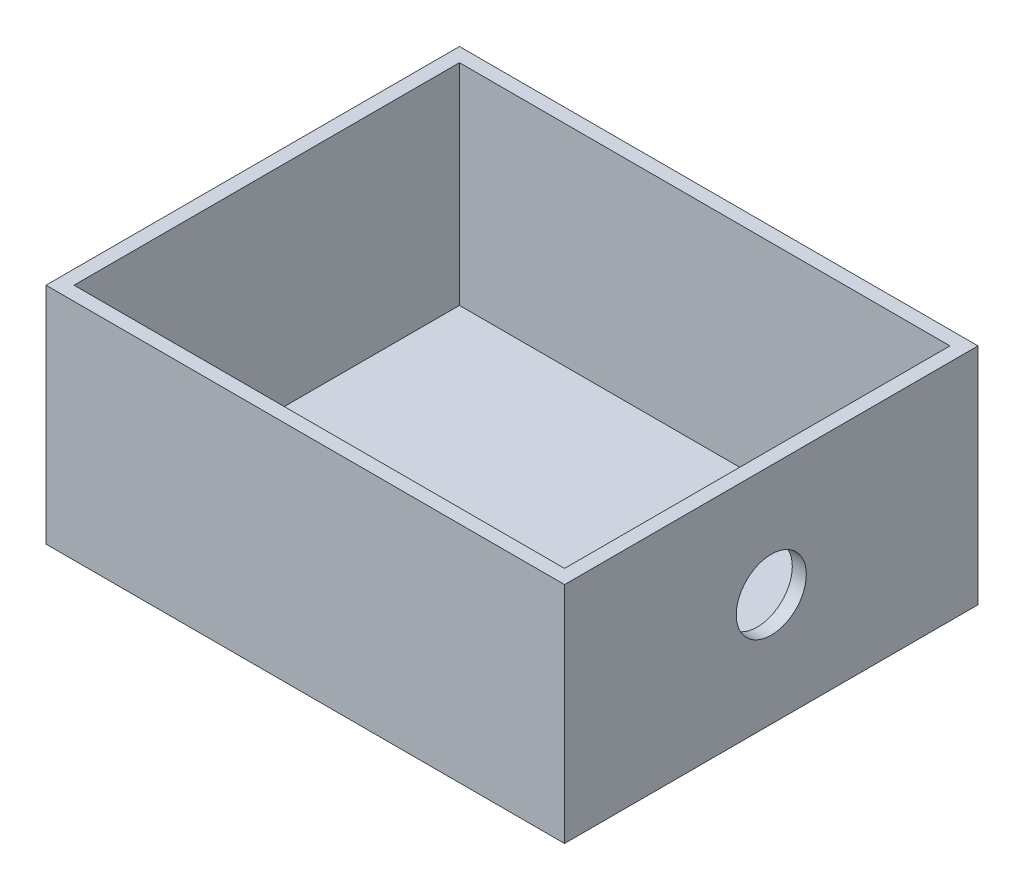
ISO-10303-21;
HEADER;
FILE_DESCRIPTION(('STEP AP214'),'2;1');
FILE_NAME('part.step','',(''),(''),'','','');
FILE_SCHEMA(('AUTOMOTIVE_DESIGN { 1 0 10303 214 1 1 1 1 }'));
ENDSEC;
DATA;
#1=APPLICATION_CONTEXT('core data for automotive mechanical design processes');
#2=APPLICATION_PROTOCOL_DEFINITION('international standard','automotive_design',2000,#1);
#3=PRODUCT_CONTEXT('',#1,'mechanical');
#4=PRODUCT('Part','Part','',(#3));
#5=PRODUCT_RELATED_PRODUCT_CATEGORY('part','',(#4));
#6=PRODUCT_DEFINITION_FORMATION('','',#4);
#7=PRODUCT_DEFINITION_CONTEXT('part definition',#1,'design');
#8=PRODUCT_DEFINITION('design','',#6,#7);
#9=PRODUCT_DEFINITION_SHAPE('','',#8);
#10=(LENGTH_UNIT() NAMED_UNIT(*) SI_UNIT(.MILLI.,.METRE.));
#11=(NAMED_UNIT(*) PLANE_ANGLE_UNIT() SI_UNIT($,.RADIAN.));
#12=(NAMED_UNIT(*) SI_UNIT($,.STERADIAN.) SOLID_ANGLE_UNIT());
#13=UNCERTAINTY_MEASURE_WITH_UNIT(LENGTH_MEASURE(1.E-05),#10,'distance_accuracy_value','');
#14=(GEOMETRIC_REPRESENTATION_CONTEXT(3) GLOBAL_UNCERTAINTY_ASSIGNED_CONTEXT((#13)) GLOBAL_UNIT_ASSIGNED_CONTEXT((#10,
#11,#12)) REPRESENTATION_CONTEXT('',''));
#15=CARTESIAN_POINT('',(0.,0.,0.));
#16=DIRECTION('',(0.,0.,1.));
#17=DIRECTION('',(1.,0.,0.));
#18=AXIS2_PLACEMENT_3D('',#15,#16,#17);
#19=CARTESIAN_POINT('',(0.,32.,0.));
#20=DIRECTION('',(0.,-1.,0.));
#21=DIRECTION('',(0.,0.,-1.));
#22=AXIS2_PLACEMENT_3D('',#19,#20,#21);
#23=PLANE('',#22);
#24=DIRECTION('',(0.,0.,-1.));
#25=VECTOR('',#24,1.);
#26=CARTESIAN_POINT('',(37.,32.,29.5));
#27=LINE('',#26,#25);
#28=CARTESIAN_POINT('',(37.,32.,29.5));
#29=VERTEX_POINT('',#28);
#30=CARTESIAN_POINT('',(37.,32.,-29.5));
#31=VERTEX_POINT('',#30);
#32=EDGE_CURVE('E158',#29,#31,#27,.T.);
#33=ORIENTED_EDGE('',*,*,#32,.T.);
#34=DIRECTION('',(-1.,0.,0.));
#35=VECTOR('',#34,1.);
#36=CARTESIAN_POINT('',(-37.,32.,-29.5));
#37=LINE('',#36,#35);
#38=CARTESIAN_POINT('',(-37.,32.,-29.5));
#39=VERTEX_POINT('',#38);
#40=EDGE_CURVE('E93',#31,#39,#37,.T.);
#41=ORIENTED_EDGE('',*,*,#40,.T.);
#42=DIRECTION('',(0.,0.,1.));
#43=VECTOR('',#42,1.);
#44=CARTESIAN_POINT('',(-37.,32.,29.5));
#45=LINE('',#44,#43);
#46=CARTESIAN_POINT('',(-37.,32.,29.5));
#47=VERTEX_POINT('',#46);
#48=EDGE_CURVE('E163',#39,#47,#45,.T.);
#49=ORIENTED_EDGE('',*,*,#48,.T.);
#50=DIRECTION('',(1.,0.,0.));
#51=VECTOR('',#50,1.);
#52=CARTESIAN_POINT('',(-37.,32.,29.5));
#53=LINE('',#52,#51);
#54=EDGE_CURVE('E65',#47,#29,#53,.T.);
#55=ORIENTED_EDGE('',*,*,#54,.T.);
#56=EDGE_LOOP('',(#33,#41,#49,#55));
#57=FACE_BOUND('',#56,.T.);
#58=DIRECTION('',(0.,0.,-1.));
#59=VECTOR('',#58,1.);
#60=CARTESIAN_POINT('',(35.,32.,0.));
#61=LINE('',#60,#59);
#62=CARTESIAN_POINT('',(35.,32.,27.5));
#63=VERTEX_POINT('',#62);
#64=CARTESIAN_POINT('',(35.,32.,-27.5));
#65=VERTEX_POINT('',#64);
#66=EDGE_CURVE('E142',#63,#65,#61,.T.);
#67=ORIENTED_EDGE('',*,*,#66,.F.);
#68=DIRECTION('',(1.,0.,0.));
#69=VECTOR('',#68,1.);
#70=CARTESIAN_POINT('',(0.,32.,27.5));
#71=LINE('',#70,#69);
#72=CARTESIAN_POINT('',(-35.,32.,27.5));
#73=VERTEX_POINT('',#72);
#74=EDGE_CURVE('E155',#73,#63,#71,.T.);
#75=ORIENTED_EDGE('',*,*,#74,.F.);
#76=DIRECTION('',(0.,0.,1.));
#77=VECTOR('',#76,1.);
#78=CARTESIAN_POINT('',(-35.,32.,0.));
#79=LINE('',#78,#77);
#80=CARTESIAN_POINT('',(-35.,32.,-27.5));
#81=VERTEX_POINT('',#80);
#82=EDGE_CURVE('E152',#81,#73,#79,.T.);
#83=ORIENTED_EDGE('',*,*,#82,.F.);
#84=DIRECTION('',(-1.,0.,0.));
#85=VECTOR('',#84,1.);
#86=CARTESIAN_POINT('',(0.,32.,-27.5));
#87=LINE('',#86,#85);
#88=EDGE_CURVE('E131',#65,#81,#87,.T.);
#89=ORIENTED_EDGE('',*,*,#88,.F.);
#90=EDGE_LOOP('',(#67,#75,#83,#89));
#91=FACE_BOUND('',#90,.T.);
#92=ADVANCED_FACE('F39',(#57,#91),#23,.F.);
#93=CARTESIAN_POINT('',(37.,32.,29.5));
#94=DIRECTION('',(-1.,0.,0.));
#95=DIRECTION('',(0.,0.,1.));
#96=AXIS2_PLACEMENT_3D('',#93,#94,#95);
#97=PLANE('',#96);
#98=CARTESIAN_POINT('',(37.,16.,0.));
#99=DIRECTION('',(1.,0.,0.));
#100=DIRECTION('',(0.,0.,-1.));
#101=AXIS2_PLACEMENT_3D('',#98,#99,#100);
#102=CIRCLE('',#101,5.);
#103=CARTESIAN_POINT('',(37.,16.,-5.00000000000001));
#104=VERTEX_POINT('',#103);
#105=EDGE_CURVE('E240',#104,#104,#102,.T.);
#106=ORIENTED_EDGE('',*,*,#105,.F.);
#107=EDGE_LOOP('',(#106));
#108=FACE_BOUND('',#107,.T.);
#109=DIRECTION('',(0.,0.,-1.));
#110=VECTOR('',#109,1.);
#111=CARTESIAN_POINT('',(37.,0.,29.5));
#112=LINE('',#111,#110);
#113=CARTESIAN_POINT('',(37.,0.,29.5));
#114=VERTEX_POINT('',#113);
#115=CARTESIAN_POINT('',(37.,0.,-29.5));
#116=VERTEX_POINT('',#115);
#117=EDGE_CURVE('E169',#114,#116,#112,.T.);
#118=ORIENTED_EDGE('',*,*,#117,.T.);
#119=DIRECTION('',(0.,-1.,0.));
#120=VECTOR('',#119,1.);
#121=CARTESIAN_POINT('',(37.,32.,-29.5));
#122=LINE('',#121,#120);
#123=EDGE_CURVE('E11',#31,#116,#122,.T.);
#124=ORIENTED_EDGE('',*,*,#123,.F.);
#125=ORIENTED_EDGE('',*,*,#32,.F.);
#126=DIRECTION('',(0.,-1.,0.));
#127=VECTOR('',#126,1.);
#128=CARTESIAN_POINT('',(37.,32.,29.5));
#129=LINE('',#128,#127);
#130=EDGE_CURVE('E168',#29,#114,#129,.T.);
#131=ORIENTED_EDGE('',*,*,#130,.T.);
#132=EDGE_LOOP('',(#118,#124,#125,#131));
#133=FACE_BOUND('',#132,.T.);
#134=ADVANCED_FACE('F41',(#108,#133),#97,.F.);
#135=CARTESIAN_POINT('',(-37.,32.,-29.5));
#136=DIRECTION('',(0.,0.,1.));
#137=DIRECTION('',(1.,0.,0.));
#138=AXIS2_PLACEMENT_3D('',#135,#136,#137);
#139=PLANE('',#138);
#140=DIRECTION('',(-1.,0.,0.));
#141=VECTOR('',#140,1.);
#142=CARTESIAN_POINT('',(-37.,0.,-29.5));
#143=LINE('',#142,#141);
#144=CARTESIAN_POINT('',(-37.,0.,-29.5));
#145=VERTEX_POINT('',#144);
#146=EDGE_CURVE('E173',#116,#145,#143,.T.);
#147=ORIENTED_EDGE('',*,*,#146,.T.);
#148=DIRECTION('',(0.,-1.,0.));
#149=VECTOR('',#148,1.);
#150=CARTESIAN_POINT('',(-37.,32.,-29.5));
#151=LINE('',#150,#149);
#152=EDGE_CURVE('E49',#39,#145,#151,.T.);
#153=ORIENTED_EDGE('',*,*,#152,.F.);
#154=ORIENTED_EDGE('',*,*,#40,.F.);
#155=ORIENTED_EDGE('',*,*,#123,.T.);
#156=EDGE_LOOP('',(#147,#153,#154,#155));
#157=FACE_BOUND('',#156,.T.);
#158=ADVANCED_FACE('F208',(#157),#139,.F.);
#159=CARTESIAN_POINT('',(-37.,32.,29.5));
#160=DIRECTION('',(1.,0.,0.));
#161=DIRECTION('',(0.,0.,-1.));
#162=AXIS2_PLACEMENT_3D('',#159,#160,#161);
#163=PLANE('',#162);
#164=DIRECTION('',(0.,0.,1.));
#165=VECTOR('',#164,1.);
#166=CARTESIAN_POINT('',(-37.,0.,29.5));
#167=LINE('',#166,#165);
#168=CARTESIAN_POINT('',(-37.,0.,29.5));
#169=VERTEX_POINT('',#168);
#170=EDGE_CURVE('E176',#145,#169,#167,.T.);
#171=ORIENTED_EDGE('',*,*,#170,.T.);
#172=DIRECTION('',(0.,-1.,0.));
#173=VECTOR('',#172,1.);
#174=CARTESIAN_POINT('',(-37.,32.,29.5));
#175=LINE('',#174,#173);
#176=EDGE_CURVE('E183',#47,#169,#175,.T.);
#177=ORIENTED_EDGE('',*,*,#176,.F.);
#178=ORIENTED_EDGE('',*,*,#48,.F.);
#179=ORIENTED_EDGE('',*,*,#152,.T.);
#180=EDGE_LOOP('',(#171,#177,#178,#179));
#181=FACE_BOUND('',#180,.T.);
#182=ADVANCED_FACE('F191',(#181),#163,.F.);
#183=CARTESIAN_POINT('',(-37.,32.,29.5));
#184=DIRECTION('',(0.,0.,-1.));
#185=DIRECTION('',(-1.,0.,0.));
#186=AXIS2_PLACEMENT_3D('',#183,#184,#185);
#187=PLANE('',#186);
#188=DIRECTION('',(1.,0.,0.));
#189=VECTOR('',#188,1.);
#190=CARTESIAN_POINT('',(-37.,0.,29.5));
#191=LINE('',#190,#189);
#192=EDGE_CURVE('E86',#169,#114,#191,.T.);
#193=ORIENTED_EDGE('',*,*,#192,.T.);
#194=ORIENTED_EDGE('',*,*,#130,.F.);
#195=ORIENTED_EDGE('',*,*,#54,.F.);
#196=ORIENTED_EDGE('',*,*,#176,.T.);
#197=EDGE_LOOP('',(#193,#194,#195,#196));
#198=FACE_BOUND('',#197,.T.);
#199=ADVANCED_FACE('F199',(#198),#187,.F.);
#200=CARTESIAN_POINT('',(0.,0.,0.));
#201=DIRECTION('',(0.,-1.,0.));
#202=DIRECTION('',(0.,0.,-1.));
#203=AXIS2_PLACEMENT_3D('',#200,#201,#202);
#204=PLANE('',#203);
#205=ORIENTED_EDGE('',*,*,#117,.F.);
#206=ORIENTED_EDGE('',*,*,#192,.F.);
#207=ORIENTED_EDGE('',*,*,#170,.F.);
#208=ORIENTED_EDGE('',*,*,#146,.F.);
#209=EDGE_LOOP('',(#205,#206,#207,#208));
#210=FACE_BOUND('',#209,.T.);
#211=ADVANCED_FACE('F195',(#210),#204,.T.);
#212=CARTESIAN_POINT('',(35.,32.,29.5));
#213=DIRECTION('',(-1.,0.,0.));
#214=DIRECTION('',(0.,0.,1.));
#215=AXIS2_PLACEMENT_3D('',#212,#213,#214);
#216=PLANE('',#215);
#217=CARTESIAN_POINT('',(35.,16.,0.));
#218=DIRECTION('',(-1.,0.,0.));
#219=DIRECTION('',(0.,0.,1.));
#220=AXIS2_PLACEMENT_3D('',#217,#218,#219);
#221=CIRCLE('',#220,5.);
#222=CARTESIAN_POINT('',(35.,16.,5.));
#223=VERTEX_POINT('',#222);
#224=EDGE_CURVE('E43',#223,#223,#221,.T.);
#225=ORIENTED_EDGE('',*,*,#224,.F.);
#226=EDGE_LOOP('',(#225));
#227=FACE_BOUND('',#226,.T.);
#228=DIRECTION('',(0.,0.,-1.));
#229=VECTOR('',#228,1.);
#230=CARTESIAN_POINT('',(35.,2.,0.));
#231=LINE('',#230,#229);
#232=CARTESIAN_POINT('',(35.,2.,27.5));
#233=VERTEX_POINT('',#232);
#234=CARTESIAN_POINT('',(35.,2.,-27.5));
#235=VERTEX_POINT('',#234);
#236=EDGE_CURVE('E121',#233,#235,#231,.T.);
#237=ORIENTED_EDGE('',*,*,#236,.F.);
#238=DIRECTION('',(0.,-1.,0.));
#239=VECTOR('',#238,1.);
#240=CARTESIAN_POINT('',(35.,32.,27.5));
#241=LINE('',#240,#239);
#242=EDGE_CURVE('E146',#63,#233,#241,.T.);
#243=ORIENTED_EDGE('',*,*,#242,.F.);
#244=ORIENTED_EDGE('',*,*,#66,.T.);
#245=DIRECTION('',(0.,-1.,0.));
#246=VECTOR('',#245,1.);
#247=CARTESIAN_POINT('',(35.,32.,-27.5));
#248=LINE('',#247,#246);
#249=EDGE_CURVE('E135',#65,#235,#248,.T.);
#250=ORIENTED_EDGE('',*,*,#249,.T.);
#251=EDGE_LOOP('',(#237,#243,#244,#250));
#252=FACE_BOUND('',#251,.T.);
#253=ADVANCED_FACE('F206',(#227,#252),#216,.T.);
#254=CARTESIAN_POINT('',(-37.,32.,-27.5));
#255=DIRECTION('',(0.,0.,1.));
#256=DIRECTION('',(1.,0.,0.));
#257=AXIS2_PLACEMENT_3D('',#254,#255,#256);
#258=PLANE('',#257);
#259=DIRECTION('',(-1.,0.,0.));
#260=VECTOR('',#259,1.);
#261=CARTESIAN_POINT('',(0.,2.,-27.5));
#262=LINE('',#261,#260);
#263=CARTESIAN_POINT('',(-35.,2.,-27.5));
#264=VERTEX_POINT('',#263);
#265=EDGE_CURVE('E115',#235,#264,#262,.T.);
#266=ORIENTED_EDGE('',*,*,#265,.F.);
#267=ORIENTED_EDGE('',*,*,#249,.F.);
#268=ORIENTED_EDGE('',*,*,#88,.T.);
#269=DIRECTION('',(0.,-1.,0.));
#270=VECTOR('',#269,1.);
#271=CARTESIAN_POINT('',(-35.,32.,-27.5));
#272=LINE('',#271,#270);
#273=EDGE_CURVE('E128',#81,#264,#272,.T.);
#274=ORIENTED_EDGE('',*,*,#273,.T.);
#275=EDGE_LOOP('',(#266,#267,#268,#274));
#276=FACE_BOUND('',#275,.T.);
#277=ADVANCED_FACE('F129',(#276),#258,.T.);
#278=CARTESIAN_POINT('',(-35.,32.,29.5));
#279=DIRECTION('',(1.,0.,0.));
#280=DIRECTION('',(0.,0.,-1.));
#281=AXIS2_PLACEMENT_3D('',#278,#279,#280);
#282=PLANE('',#281);
#283=DIRECTION('',(0.,0.,1.));
#284=VECTOR('',#283,1.);
#285=CARTESIAN_POINT('',(-35.,2.,0.));
#286=LINE('',#285,#284);
#287=CARTESIAN_POINT('',(-35.,2.,27.5));
#288=VERTEX_POINT('',#287);
#289=EDGE_CURVE('E119',#264,#288,#286,.T.);
#290=ORIENTED_EDGE('',*,*,#289,.F.);
#291=ORIENTED_EDGE('',*,*,#273,.F.);
#292=ORIENTED_EDGE('',*,*,#82,.T.);
#293=DIRECTION('',(0.,-1.,0.));
#294=VECTOR('',#293,1.);
#295=CARTESIAN_POINT('',(-35.,32.,27.5));
#296=LINE('',#295,#294);
#297=EDGE_CURVE('E56',#73,#288,#296,.T.);
#298=ORIENTED_EDGE('',*,*,#297,.T.);
#299=EDGE_LOOP('',(#290,#291,#292,#298));
#300=FACE_BOUND('',#299,.T.);
#301=ADVANCED_FACE('F137',(#300),#282,.T.);
#302=CARTESIAN_POINT('',(-37.,32.,27.5));
#303=DIRECTION('',(0.,0.,-1.));
#304=DIRECTION('',(-1.,0.,0.));
#305=AXIS2_PLACEMENT_3D('',#302,#303,#304);
#306=PLANE('',#305);
#307=DIRECTION('',(1.,0.,0.));
#308=VECTOR('',#307,1.);
#309=CARTESIAN_POINT('',(0.,2.,27.5));
#310=LINE('',#309,#308);
#311=EDGE_CURVE('E139',#288,#233,#310,.T.);
#312=ORIENTED_EDGE('',*,*,#311,.F.);
#313=ORIENTED_EDGE('',*,*,#297,.F.);
#314=ORIENTED_EDGE('',*,*,#74,.T.);
#315=ORIENTED_EDGE('',*,*,#242,.T.);
#316=EDGE_LOOP('',(#312,#313,#314,#315));
#317=FACE_BOUND('',#316,.T.);
#318=ADVANCED_FACE('F221',(#317),#306,.T.);
#319=CARTESIAN_POINT('',(0.,2.,0.));
#320=DIRECTION('',(0.,-1.,0.));
#321=DIRECTION('',(0.,0.,-1.));
#322=AXIS2_PLACEMENT_3D('',#319,#320,#321);
#323=PLANE('',#322);
#324=ORIENTED_EDGE('',*,*,#236,.T.);
#325=ORIENTED_EDGE('',*,*,#265,.T.);
#326=ORIENTED_EDGE('',*,*,#289,.T.);
#327=ORIENTED_EDGE('',*,*,#311,.T.);
#328=EDGE_LOOP('',(#324,#325,#326,#327));
#329=FACE_BOUND('',#328,.T.);
#330=ADVANCED_FACE('F117',(#329),#323,.F.);
#331=CARTESIAN_POINT('',(34.,16.,0.));
#332=DIRECTION('',(1.,0.,0.));
#333=DIRECTION('',(0.,0.,-1.));
#334=AXIS2_PLACEMENT_3D('',#331,#332,#333);
#335=CYLINDRICAL_SURFACE('',#334,5.);
#336=ORIENTED_EDGE('',*,*,#224,.T.);
#337=EDGE_LOOP('',(#336));
#338=FACE_BOUND('',#337,.T.);
#339=ORIENTED_EDGE('',*,*,#105,.T.);
#340=EDGE_LOOP('',(#339));
#341=FACE_BOUND('',#340,.T.);
#342=ADVANCED_FACE('F220',(#338,#341),#335,.F.);
#343=CLOSED_SHELL('',(#92,#134,#158,#182,#199,#211,#253,#277,#301,#318,#330,#342));
#344=MANIFOLD_SOLID_BREP('B2',#343);
#345=ADVANCED_BREP_SHAPE_REPRESENTATION('',(#18,#344),#14);
#346=SHAPE_DEFINITION_REPRESENTATION(#9,#345);
ENDSEC;
END-ISO-10303-21;
